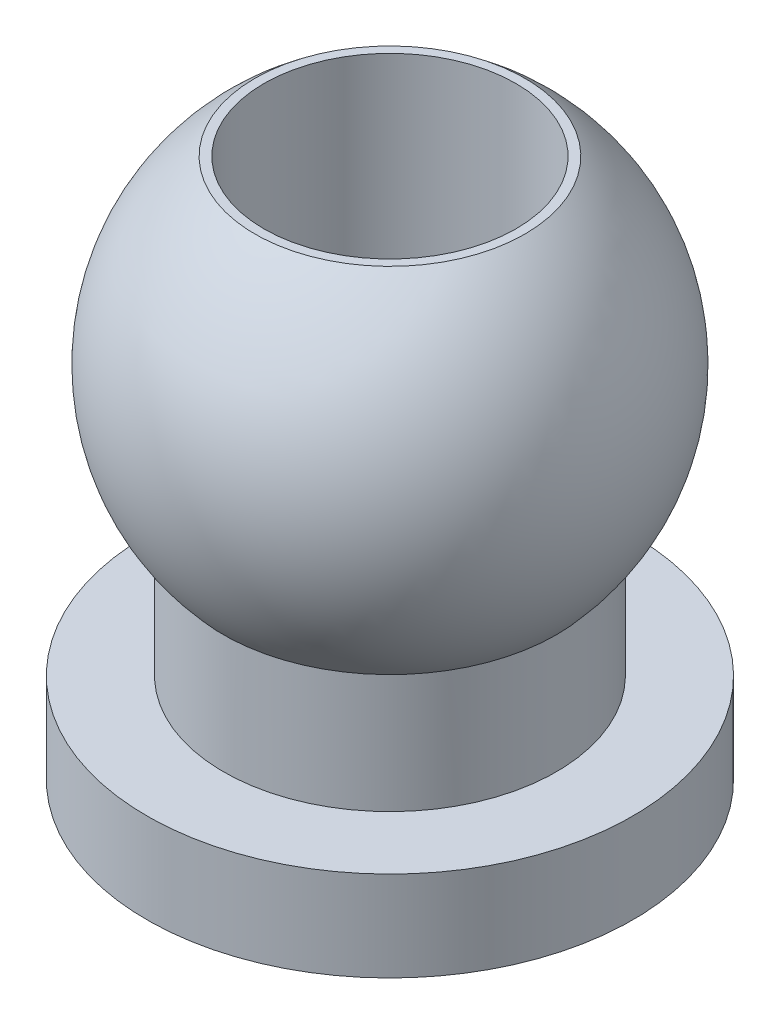
ISO-10303-21;
HEADER;
FILE_DESCRIPTION(('STEP AP214'),'2;1');
FILE_NAME('part.step','',(''),(''),'','','');
FILE_SCHEMA(('AUTOMOTIVE_DESIGN { 1 0 10303 214 1 1 1 1 }'));
ENDSEC;
DATA;
#1=APPLICATION_CONTEXT('core data for automotive mechanical design processes');
#2=APPLICATION_PROTOCOL_DEFINITION('international standard','automotive_design',2000,#1);
#3=PRODUCT_CONTEXT('',#1,'mechanical');
#4=PRODUCT('Part','Part','',(#3));
#5=PRODUCT_RELATED_PRODUCT_CATEGORY('part','',(#4));
#6=PRODUCT_DEFINITION_FORMATION('','',#4);
#7=PRODUCT_DEFINITION_CONTEXT('part definition',#1,'design');
#8=PRODUCT_DEFINITION('design','',#6,#7);
#9=PRODUCT_DEFINITION_SHAPE('','',#8);
#10=(LENGTH_UNIT() NAMED_UNIT(*) SI_UNIT(.MILLI.,.METRE.));
#11=(NAMED_UNIT(*) PLANE_ANGLE_UNIT() SI_UNIT($,.RADIAN.));
#12=(NAMED_UNIT(*) SI_UNIT($,.STERADIAN.) SOLID_ANGLE_UNIT());
#13=UNCERTAINTY_MEASURE_WITH_UNIT(LENGTH_MEASURE(1.E-05),#10,'distance_accuracy_value','');
#14=(GEOMETRIC_REPRESENTATION_CONTEXT(3) GLOBAL_UNCERTAINTY_ASSIGNED_CONTEXT((#13)) GLOBAL_UNIT_ASSIGNED_CONTEXT((#10,
#11,#12)) REPRESENTATION_CONTEXT('',''));
#15=CARTESIAN_POINT('',(0.,0.,0.));
#16=DIRECTION('',(0.,0.,1.));
#17=DIRECTION('',(1.,0.,0.));
#18=AXIS2_PLACEMENT_3D('',#15,#16,#17);
#19=CARTESIAN_POINT('',(0.,0.,0.));
#20=DIRECTION('',(0.,1.,0.));
#21=DIRECTION('',(1.,0.,0.));
#22=AXIS2_PLACEMENT_3D('',#19,#20,#21);
#23=SPHERICAL_SURFACE('',#22,2.5);
#24=CARTESIAN_POINT('',(0.,2.,0.));
#25=DIRECTION('',(0.,1.,0.));
#26=DIRECTION('',(-1.,0.,0.));
#27=AXIS2_PLACEMENT_3D('',#24,#25,#26);
#28=CIRCLE('',#27,1.5);
#29=CARTESIAN_POINT('',(1.5,2.,0.));
#30=VERTEX_POINT('',#29);
#31=EDGE_CURVE('E10',#30,#30,#28,.T.);
#32=CARTESIAN_POINT('',(0.,-1.68151717208002,0.));
#33=DIRECTION('',(0.,1.,0.));
#34=DIRECTION('',(-1.,0.,0.));
#35=AXIS2_PLACEMENT_3D('',#32,#33,#34);
#36=CIRCLE('',#35,1.85);
#37=CARTESIAN_POINT('',(1.85,-1.68151717208002,0.));
#38=VERTEX_POINT('',#37);
#39=EDGE_CURVE('E55',#38,#38,#36,.T.);
#40=CARTESIAN_POINT('',(1.5,2.,0.));
#41=CARTESIAN_POINT('',(1.53468864275656,1.97398488700186,0.));
#42=CARTESIAN_POINT('',(1.56869908557178,1.94706567207474,0.));
#43=CARTESIAN_POINT('',(1.63527460039695,1.89149559741412,0.));
#44=CARTESIAN_POINT('',(1.66783967240691,1.86284473768062,0.));
#45=CARTESIAN_POINT('',(1.73143547469903,1.80388793245882,0.));
#46=CARTESIAN_POINT('',(1.76246620498118,1.77358198697051,0.));
#47=CARTESIAN_POINT('',(1.82290955418229,1.71139730502004,0.));
#48=CARTESIAN_POINT('',(1.85232217310123,1.67951856855787,0.));
#49=CARTESIAN_POINT('',(1.90944962881412,1.61427452001259,0.));
#50=CARTESIAN_POINT('',(1.93716446560806,1.58090920792948,0.));
#51=CARTESIAN_POINT('',(1.99082135697394,1.51278233739219,0.));
#52=CARTESIAN_POINT('',(2.01676341154588,1.478020778938,0.));
#53=CARTESIAN_POINT('',(2.06680451661008,1.40719549998046,0.));
#54=CARTESIAN_POINT('',(2.09090356710234,1.3711317794771,0.));
#55=CARTESIAN_POINT('',(2.13719343602909,1.29779979179089,0.));
#56=CARTESIAN_POINT('',(2.15938425446358,1.26053152460804,0.));
#57=CARTESIAN_POINT('',(2.20179759487791,1.18489131755534,0.));
#58=CARTESIAN_POINT('',(2.22202011685776,1.14651937768549,0.));
#59=CARTESIAN_POINT('',(2.26044212795992,1.06877568703705,0.));
#60=CARTESIAN_POINT('',(2.27864161708222,1.02940393625846,0.));
#61=CARTESIAN_POINT('',(2.31296830172393,0.949767191643558,0.));
#62=CARTESIAN_POINT('',(2.32909549724333,0.909502197807242,0.));
#63=CARTESIAN_POINT('',(2.35923394305775,0.828187952710417,0.));
#64=CARTESIAN_POINT('',(2.37324519335277,0.787138701449907,0.));
#65=CARTESIAN_POINT('',(2.39911382433773,0.704367049886015,0.));
#66=CARTESIAN_POINT('',(2.41097120502767,0.662644649582632,0.));
#67=CARTESIAN_POINT('',(2.43250000232232,0.578639630335371,0.));
#68=CARTESIAN_POINT('',(2.44217141892703,0.536357011391493,0.));
#69=CARTESIAN_POINT('',(2.45930211033946,0.451346001613886,0.));
#70=CARTESIAN_POINT('',(2.46676138514718,0.408617610780157,0.));
#71=CARTESIAN_POINT('',(2.47944760287844,0.322830710548511,0.));
#72=CARTESIAN_POINT('',(2.48467454580198,0.279772201150593,0.));
#73=CARTESIAN_POINT('',(2.49288195195072,0.193441610651119,0.));
#74=CARTESIAN_POINT('',(2.49586241517592,0.150169529549562,0.));
#75=CARTESIAN_POINT('',(2.49956879468097,0.0635289205798425,0.));
#76=CARTESIAN_POINT('',(2.50029471096082,0.0201603927116794,0.));
#77=CARTESIAN_POINT('',(2.49949003173092,-0.0665557238008423,0.));
#78=CARTESIAN_POINT('',(2.49795943622116,-0.109903312445201,0.));
#79=CARTESIAN_POINT('',(2.49264587628901,-0.196460221196232,0.));
#80=CARTESIAN_POINT('',(2.48886291186662,-0.239669541302904,0.));
#81=CARTESIAN_POINT('',(2.47905485349305,-0.325832957916865,0.));
#82=CARTESIAN_POINT('',(2.47302975954186,-0.368787054424153,0.));
#83=CARTESIAN_POINT('',(2.45875375028941,-0.454323759595671,0.));
#84=CARTESIAN_POINT('',(2.45050283498814,-0.496906368259901,0.));
#85=CARTESIAN_POINT('',(2.43179751585621,-0.58158483900379,0.));
#86=CARTESIAN_POINT('',(2.42134311202554,-0.623680701083448,0.));
#87=CARTESIAN_POINT('',(2.39825911289165,-0.707271737425631,0.));
#88=CARTESIAN_POINT('',(2.38562951758842,-0.748766911688156,0.));
#89=CARTESIAN_POINT('',(2.35822932005131,-0.831044256947983,0.));
#90=CARTESIAN_POINT('',(2.34345871781742,-0.871826427945286,0.));
#91=CARTESIAN_POINT('',(2.3118164865125,-0.9525673815024,0.));
#92=CARTESIAN_POINT('',(2.29494485744146,-0.992526164062211,0.));
#93=CARTESIAN_POINT('',(2.25914623767545,-1.07151218281432,0.));
#94=CARTESIAN_POINT('',(2.24021924698047,-1.11053941900662,0.));
#95=CARTESIAN_POINT('',(2.20036113897257,-1.18755671385839,0.));
#96=CARTESIAN_POINT('',(2.17943002165963,-1.22554677251786,0.));
#97=CARTESIAN_POINT('',(2.13562029565163,-1.30038686854874,0.));
#98=CARTESIAN_POINT('',(2.11274168695656,-1.33723690592014,0.));
#99=CARTESIAN_POINT('',(2.06509897561804,-1.4096972756973,0.));
#100=CARTESIAN_POINT('',(2.04033487297459,-1.44530760810305,0.));
#101=CARTESIAN_POINT('',(1.9889879353938,-1.51519196223339,0.));
#102=CARTESIAN_POINT('',(1.96240510045647,-1.54946598395797,0.));
#103=CARTESIAN_POINT('',(1.90749364886828,-1.61658576387792,0.));
#104=CARTESIAN_POINT('',(1.87916503221743,-1.64943152207329,0.));
#105=CARTESIAN_POINT('',(1.85,-1.68151717208002,0.));
#106=B_SPLINE_CURVE_WITH_KNOTS('',3,(#40,#41,#42,#43,#44,#45,#46,#47,#48,#49,#50,#51,#52,#53,
#54,#55,#56,#57,#58,#59,#60,#61,#62,#63,#64,#65,#66,#67,#68,#69,#70,#71,#72,#73,#74,#75,#76,#77,
#78,#79,#80,#81,#82,#83,#84,#85,#86,#87,#88,#89,#90,#91,#92,#93,#94,#95,#96,#97,#98,#99,#100,
#101,#102,#103,#104,#105),.UNSPECIFIED.,.F.,.F.,(4,2,2,2,2,2,2,2,2,2,2,2,2,2,2,2,2,2,2,2,2,2,2,
2,2,2,2,2,2,2,2,2,4),(0.,0.130065107039433,0.260130214078865,0.390195321118298,
0.520260428157731,0.650325535197164,0.780390642236596,0.910455749276029,1.04052085631546,
1.17058596335489,1.30065107039433,1.43071617743376,1.56078128447319,1.69084639151262,
1.82091149855206,1.95097660559149,2.08104171263092,2.21110681967036,2.34117192670979,
2.47123703374922,2.60130214078865,2.73136724782809,2.86143235486752,2.99149746190695,
3.12156256894638,3.25162767598582,3.38169278302525,3.51175789006468,3.64182299710411,
3.77188810414355,3.90195321118298,4.03201831822241,4.16208342526184),.UNSPECIFIED.);
#107=EDGE_CURVE('BSEAM30',#30,#38,#106,.T.);
#108=ORIENTED_EDGE('',*,*,#31,.F.);
#109=ORIENTED_EDGE('',*,*,#39,.T.);
#110=ORIENTED_EDGE('',*,*,#107,.T.);
#111=ORIENTED_EDGE('',*,*,#107,.F.);
#112=EDGE_LOOP('',(#108,#110,#109,#111));
#113=FACE_BOUND('',#112,.T.);
#114=ADVANCED_FACE('F30',(#113),#23,.T.);
#115=CARTESIAN_POINT('',(1.5,2.,0.));
#116=DIRECTION('',(0.,-1.,0.));
#117=DIRECTION('',(1.,0.,0.));
#118=AXIS2_PLACEMENT_3D('',#115,#116,#117);
#119=PLANE('',#118);
#120=CARTESIAN_POINT('',(0.,2.,0.));
#121=DIRECTION('',(0.,1.,0.));
#122=DIRECTION('',(-1.,0.,0.));
#123=AXIS2_PLACEMENT_3D('',#120,#121,#122);
#124=CIRCLE('',#123,1.4);
#125=CARTESIAN_POINT('',(-1.4,2.,0.));
#126=VERTEX_POINT('',#125);
#127=EDGE_CURVE('E36',#126,#126,#124,.T.);
#128=ORIENTED_EDGE('',*,*,#127,.F.);
#129=EDGE_LOOP('',(#128));
#130=FACE_BOUND('',#129,.T.);
#131=ORIENTED_EDGE('',*,*,#31,.T.);
#132=EDGE_LOOP('',(#131));
#133=FACE_BOUND('',#132,.T.);
#134=ADVANCED_FACE('F86',(#130,#133),#119,.F.);
#135=CARTESIAN_POINT('',(0.,2.,0.));
#136=DIRECTION('',(0.,1.,0.));
#137=DIRECTION('',(-1.,0.,0.));
#138=AXIS2_PLACEMENT_3D('',#135,#136,#137);
#139=CYLINDRICAL_SURFACE('',#138,1.4);
#140=CARTESIAN_POINT('',(0.,-4.,0.));
#141=DIRECTION('',(0.,1.,0.));
#142=DIRECTION('',(-1.,0.,0.));
#143=AXIS2_PLACEMENT_3D('',#140,#141,#142);
#144=CIRCLE('',#143,1.4);
#145=CARTESIAN_POINT('',(-1.4,-4.,0.));
#146=VERTEX_POINT('',#145);
#147=EDGE_CURVE('E40',#146,#146,#144,.T.);
#148=ORIENTED_EDGE('',*,*,#147,.F.);
#149=EDGE_LOOP('',(#148));
#150=FACE_BOUND('',#149,.T.);
#151=ORIENTED_EDGE('',*,*,#127,.T.);
#152=EDGE_LOOP('',(#151));
#153=FACE_BOUND('',#152,.T.);
#154=ADVANCED_FACE('F81',(#150,#153),#139,.F.);
#155=CARTESIAN_POINT('',(1.4,-4.,0.));
#156=DIRECTION('',(0.,1.,0.));
#157=DIRECTION('',(-1.,0.,0.));
#158=AXIS2_PLACEMENT_3D('',#155,#156,#157);
#159=PLANE('',#158);
#160=CARTESIAN_POINT('',(0.,-4.,0.));
#161=DIRECTION('',(0.,1.,0.));
#162=DIRECTION('',(-1.,0.,0.));
#163=AXIS2_PLACEMENT_3D('',#160,#161,#162);
#164=CIRCLE('',#163,2.7);
#165=CARTESIAN_POINT('',(-2.7,-4.,0.));
#166=VERTEX_POINT('',#165);
#167=EDGE_CURVE('E44',#166,#166,#164,.T.);
#168=ORIENTED_EDGE('',*,*,#167,.F.);
#169=EDGE_LOOP('',(#168));
#170=FACE_BOUND('',#169,.T.);
#171=ORIENTED_EDGE('',*,*,#147,.T.);
#172=EDGE_LOOP('',(#171));
#173=FACE_BOUND('',#172,.T.);
#174=ADVANCED_FACE('F75',(#170,#173),#159,.F.);
#175=CARTESIAN_POINT('',(0.,2.,0.));
#176=DIRECTION('',(0.,1.,0.));
#177=DIRECTION('',(-1.,0.,0.));
#178=AXIS2_PLACEMENT_3D('',#175,#176,#177);
#179=CYLINDRICAL_SURFACE('',#178,2.7);
#180=CARTESIAN_POINT('',(0.,-3.,0.));
#181=DIRECTION('',(0.,1.,0.));
#182=DIRECTION('',(-1.,0.,0.));
#183=AXIS2_PLACEMENT_3D('',#180,#181,#182);
#184=CIRCLE('',#183,2.7);
#185=CARTESIAN_POINT('',(-2.7,-3.,0.));
#186=VERTEX_POINT('',#185);
#187=EDGE_CURVE('E49',#186,#186,#184,.T.);
#188=ORIENTED_EDGE('',*,*,#187,.F.);
#189=EDGE_LOOP('',(#188));
#190=FACE_BOUND('',#189,.T.);
#191=ORIENTED_EDGE('',*,*,#167,.T.);
#192=EDGE_LOOP('',(#191));
#193=FACE_BOUND('',#192,.T.);
#194=ADVANCED_FACE('F69',(#190,#193),#179,.T.);
#195=CARTESIAN_POINT('',(2.7,-3.,0.));
#196=DIRECTION('',(0.,-1.,0.));
#197=DIRECTION('',(1.,0.,0.));
#198=AXIS2_PLACEMENT_3D('',#195,#196,#197);
#199=PLANE('',#198);
#200=CARTESIAN_POINT('',(0.,-3.,0.));
#201=DIRECTION('',(0.,1.,0.));
#202=DIRECTION('',(-1.,0.,0.));
#203=AXIS2_PLACEMENT_3D('',#200,#201,#202);
#204=CIRCLE('',#203,1.85);
#205=CARTESIAN_POINT('',(-1.85,-3.,0.));
#206=VERTEX_POINT('',#205);
#207=EDGE_CURVE('E52',#206,#206,#204,.T.);
#208=ORIENTED_EDGE('',*,*,#207,.F.);
#209=EDGE_LOOP('',(#208));
#210=FACE_BOUND('',#209,.T.);
#211=ORIENTED_EDGE('',*,*,#187,.T.);
#212=EDGE_LOOP('',(#211));
#213=FACE_BOUND('',#212,.T.);
#214=ADVANCED_FACE('F63',(#210,#213),#199,.F.);
#215=CARTESIAN_POINT('',(0.,2.,0.));
#216=DIRECTION('',(0.,1.,0.));
#217=DIRECTION('',(-1.,0.,0.));
#218=AXIS2_PLACEMENT_3D('',#215,#216,#217);
#219=CYLINDRICAL_SURFACE('',#218,1.85);
#220=ORIENTED_EDGE('',*,*,#39,.F.);
#221=EDGE_LOOP('',(#220));
#222=FACE_BOUND('',#221,.T.);
#223=ORIENTED_EDGE('',*,*,#207,.T.);
#224=EDGE_LOOP('',(#223));
#225=FACE_BOUND('',#224,.T.);
#226=ADVANCED_FACE('F60',(#222,#225),#219,.T.);
#227=CLOSED_SHELL('',(#114,#134,#154,#174,#194,#214,#226));
#228=MANIFOLD_SOLID_BREP('B2',#227);
#229=ADVANCED_BREP_SHAPE_REPRESENTATION('',(#18,#228),#14);
#230=SHAPE_DEFINITION_REPRESENTATION(#9,#229);
ENDSEC;
END-ISO-10303-21;
